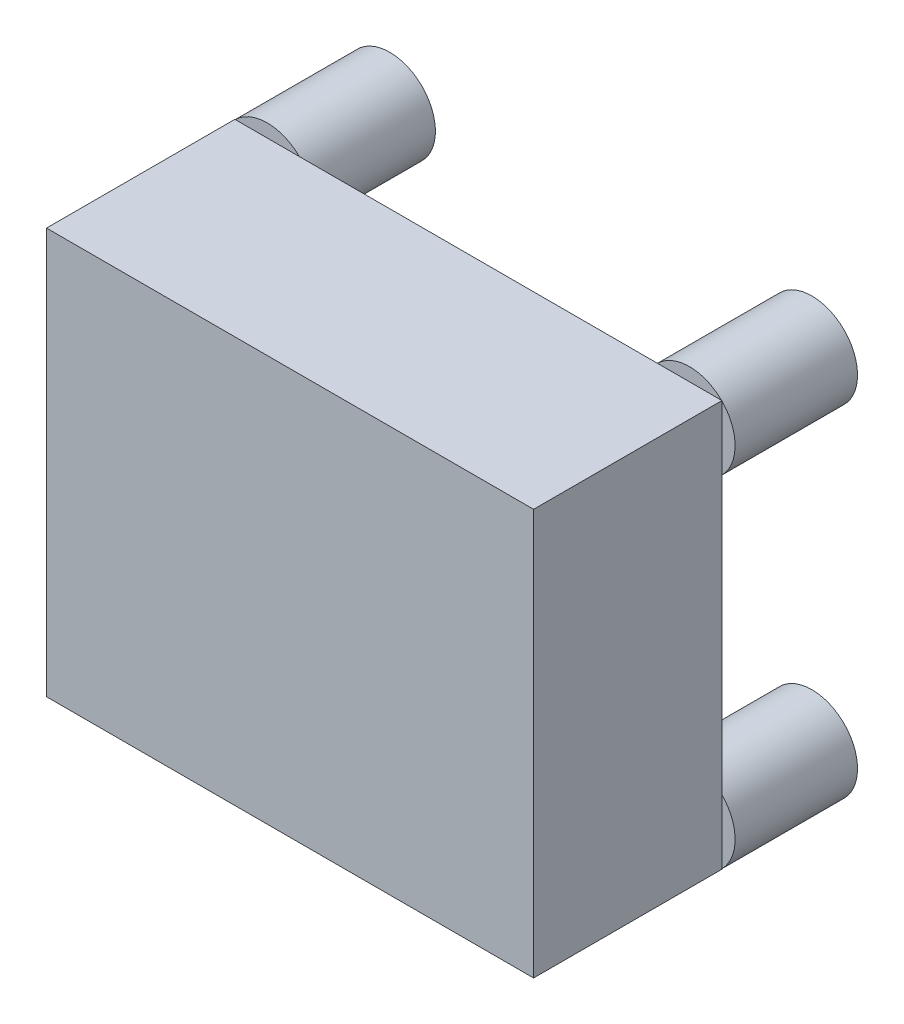
ISO-10303-21;
HEADER;
FILE_DESCRIPTION(('STEP AP214'),'2;1');
FILE_NAME('part.step','',(''),(''),'','','');
FILE_SCHEMA(('AUTOMOTIVE_DESIGN { 1 0 10303 214 1 1 1 1 }'));
ENDSEC;
DATA;
#1=APPLICATION_CONTEXT('core data for automotive mechanical design processes');
#2=APPLICATION_PROTOCOL_DEFINITION('international standard','automotive_design',2000,#1);
#3=PRODUCT_CONTEXT('',#1,'mechanical');
#4=PRODUCT('Part','Part','',(#3));
#5=PRODUCT_RELATED_PRODUCT_CATEGORY('part','',(#4));
#6=PRODUCT_DEFINITION_FORMATION('','',#4);
#7=PRODUCT_DEFINITION_CONTEXT('part definition',#1,'design');
#8=PRODUCT_DEFINITION('design','',#6,#7);
#9=PRODUCT_DEFINITION_SHAPE('','',#8);
#10=(LENGTH_UNIT() NAMED_UNIT(*) SI_UNIT(.MILLI.,.METRE.));
#11=(NAMED_UNIT(*) PLANE_ANGLE_UNIT() SI_UNIT($,.RADIAN.));
#12=(NAMED_UNIT(*) SI_UNIT($,.STERADIAN.) SOLID_ANGLE_UNIT());
#13=UNCERTAINTY_MEASURE_WITH_UNIT(LENGTH_MEASURE(1.E-05),#10,'distance_accuracy_value','');
#14=(GEOMETRIC_REPRESENTATION_CONTEXT(3) GLOBAL_UNCERTAINTY_ASSIGNED_CONTEXT((#13)) GLOBAL_UNIT_ASSIGNED_CONTEXT((#10,
#11,#12)) REPRESENTATION_CONTEXT('',''));
#15=CARTESIAN_POINT('',(0.,0.,0.));
#16=DIRECTION('',(0.,0.,1.));
#17=DIRECTION('',(1.,0.,0.));
#18=AXIS2_PLACEMENT_3D('',#15,#16,#17);
#19=CARTESIAN_POINT('',(0.,0.,0.));
#20=DIRECTION('',(0.,0.,-1.));
#21=DIRECTION('',(-1.,0.,0.));
#22=AXIS2_PLACEMENT_3D('',#19,#20,#21);
#23=PLANE('',#22);
#24=DIRECTION('',(0.,-1.,0.));
#25=VECTOR('',#24,1.);
#26=CARTESIAN_POINT('',(0.,0.,0.));
#27=LINE('',#26,#25);
#28=CARTESIAN_POINT('',(0.,26.7032052956016,0.));
#29=VERTEX_POINT('',#28);
#30=CARTESIAN_POINT('',(0.,5.04679470439843,0.));
#31=VERTEX_POINT('',#30);
#32=EDGE_CURVE('E151',#29,#31,#27,.T.);
#33=ORIENTED_EDGE('',*,*,#32,.F.);
#34=CARTESIAN_POINT('',(2.54,29.21,0.));
#35=DIRECTION('',(0.,0.,-1.));
#36=DIRECTION('',(-1.,0.,0.));
#37=AXIS2_PLACEMENT_3D('',#34,#35,#36);
#38=CIRCLE('',#37,3.5687);
#39=CARTESIAN_POINT('',(5.04679470439843,31.75,0.));
#40=VERTEX_POINT('',#39);
#41=EDGE_CURVE('E134',#40,#29,#38,.T.);
#42=ORIENTED_EDGE('',*,*,#41,.F.);
#43=DIRECTION('',(-1.,0.,0.));
#44=VECTOR('',#43,1.);
#45=CARTESIAN_POINT('',(0.,31.75,0.));
#46=LINE('',#45,#44);
#47=CARTESIAN_POINT('',(33.0532052956016,31.75,0.));
#48=VERTEX_POINT('',#47);
#49=EDGE_CURVE('E320',#48,#40,#46,.T.);
#50=ORIENTED_EDGE('',*,*,#49,.F.);
#51=CARTESIAN_POINT('',(35.56,29.21,0.));
#52=DIRECTION('',(0.,0.,-1.));
#53=DIRECTION('',(-1.,0.,0.));
#54=AXIS2_PLACEMENT_3D('',#51,#52,#53);
#55=CIRCLE('',#54,3.5687);
#56=CARTESIAN_POINT('',(38.1,26.7032052956016,0.));
#57=VERTEX_POINT('',#56);
#58=EDGE_CURVE('E129',#57,#48,#55,.T.);
#59=ORIENTED_EDGE('',*,*,#58,.F.);
#60=DIRECTION('',(0.,1.,0.));
#61=VECTOR('',#60,1.);
#62=CARTESIAN_POINT('',(38.1,0.,0.));
#63=LINE('',#62,#61);
#64=CARTESIAN_POINT('',(38.1,5.04679470439843,0.));
#65=VERTEX_POINT('',#64);
#66=EDGE_CURVE('E300',#65,#57,#63,.T.);
#67=ORIENTED_EDGE('',*,*,#66,.F.);
#68=CARTESIAN_POINT('',(35.56,2.54,0.));
#69=DIRECTION('',(0.,0.,-1.));
#70=DIRECTION('',(-1.,0.,0.));
#71=AXIS2_PLACEMENT_3D('',#68,#69,#70);
#72=CIRCLE('',#71,3.5687);
#73=CARTESIAN_POINT('',(33.0532052956016,0.,0.));
#74=VERTEX_POINT('',#73);
#75=EDGE_CURVE('E173',#74,#65,#72,.T.);
#76=ORIENTED_EDGE('',*,*,#75,.F.);
#77=DIRECTION('',(1.,0.,0.));
#78=VECTOR('',#77,1.);
#79=CARTESIAN_POINT('',(0.,0.,0.));
#80=LINE('',#79,#78);
#81=CARTESIAN_POINT('',(5.04679470439843,0.,0.));
#82=VERTEX_POINT('',#81);
#83=EDGE_CURVE('E299',#82,#74,#80,.T.);
#84=ORIENTED_EDGE('',*,*,#83,.F.);
#85=CARTESIAN_POINT('',(2.54,2.54,0.));
#86=DIRECTION('',(0.,0.,-1.));
#87=DIRECTION('',(-1.,0.,0.));
#88=AXIS2_PLACEMENT_3D('',#85,#86,#87);
#89=CIRCLE('',#88,3.5687);
#90=EDGE_CURVE('E175',#31,#82,#89,.T.);
#91=ORIENTED_EDGE('',*,*,#90,.F.);
#92=EDGE_LOOP('',(#33,#42,#50,#59,#67,#76,#84,#91));
#93=FACE_BOUND('',#92,.T.);
#94=ADVANCED_FACE('F33',(#93),#23,.T.);
#95=CARTESIAN_POINT('',(0.0332052956015729,31.75,0.));
#96=VERTEX_POINT('',#95);
#97=CARTESIAN_POINT('',(0.,31.75,0.));
#98=VERTEX_POINT('',#97);
#99=EDGE_CURVE('E143',#96,#98,#46,.T.);
#100=ORIENTED_EDGE('',*,*,#99,.F.);
#101=CARTESIAN_POINT('',(0.,31.7167947043984,0.));
#102=VERTEX_POINT('',#101);
#103=EDGE_CURVE('E48',#102,#96,#38,.T.);
#104=ORIENTED_EDGE('',*,*,#103,.F.);
#105=EDGE_CURVE('E142',#98,#102,#27,.T.);
#106=ORIENTED_EDGE('',*,*,#105,.F.);
#107=EDGE_LOOP('',(#100,#104,#106));
#108=FACE_BOUND('',#107,.T.);
#109=ADVANCED_FACE('F141',(#108),#23,.T.);
#110=CARTESIAN_POINT('',(38.1,31.7167947043984,0.));
#111=VERTEX_POINT('',#110);
#112=CARTESIAN_POINT('',(38.1,31.75,0.));
#113=VERTEX_POINT('',#112);
#114=EDGE_CURVE('E298',#111,#113,#63,.T.);
#115=ORIENTED_EDGE('',*,*,#114,.F.);
#116=CARTESIAN_POINT('',(38.0667947043984,31.75,0.));
#117=VERTEX_POINT('',#116);
#118=EDGE_CURVE('E220',#117,#111,#55,.T.);
#119=ORIENTED_EDGE('',*,*,#118,.F.);
#120=EDGE_CURVE('E182',#113,#117,#46,.T.);
#121=ORIENTED_EDGE('',*,*,#120,.F.);
#122=EDGE_LOOP('',(#115,#119,#121));
#123=FACE_BOUND('',#122,.T.);
#124=ADVANCED_FACE('F283',(#123),#23,.T.);
#125=CARTESIAN_POINT('',(0.,0.0332052956015729,0.));
#126=VERTEX_POINT('',#125);
#127=CARTESIAN_POINT('',(0.,0.,0.));
#128=VERTEX_POINT('',#127);
#129=EDGE_CURVE('E157',#126,#128,#27,.T.);
#130=ORIENTED_EDGE('',*,*,#129,.F.);
#131=CARTESIAN_POINT('',(2.54,2.54,0.));
#132=DIRECTION('',(0.,0.,-1.));
#133=DIRECTION('',(-1.,0.,0.));
#134=AXIS2_PLACEMENT_3D('',#131,#132,#133);
#135=CIRCLE('',#134,3.5687);
#136=CARTESIAN_POINT('',(0.0332052956015729,0.,0.));
#137=VERTEX_POINT('',#136);
#138=EDGE_CURVE('E11',#126,#137,#135,.F.);
#139=ORIENTED_EDGE('',*,*,#138,.T.);
#140=EDGE_CURVE('E296',#128,#137,#80,.T.);
#141=ORIENTED_EDGE('',*,*,#140,.F.);
#142=EDGE_LOOP('',(#130,#139,#141));
#143=FACE_BOUND('',#142,.T.);
#144=ADVANCED_FACE('F279',(#143),#23,.T.);
#145=CARTESIAN_POINT('',(38.1,0.0332052956015724,0.));
#146=VERTEX_POINT('',#145);
#147=CARTESIAN_POINT('',(38.0667947043984,0.,0.));
#148=VERTEX_POINT('',#147);
#149=EDGE_CURVE('E41',#146,#148,#72,.T.);
#150=ORIENTED_EDGE('',*,*,#149,.F.);
#151=CARTESIAN_POINT('',(38.1,0.,0.));
#152=VERTEX_POINT('',#151);
#153=EDGE_CURVE('E301',#152,#146,#63,.T.);
#154=ORIENTED_EDGE('',*,*,#153,.F.);
#155=EDGE_CURVE('E150',#148,#152,#80,.T.);
#156=ORIENTED_EDGE('',*,*,#155,.F.);
#157=EDGE_LOOP('',(#150,#154,#156));
#158=FACE_BOUND('',#157,.T.);
#159=ADVANCED_FACE('F287',(#158),#23,.T.);
#160=CARTESIAN_POINT('',(0.,0.,14.732));
#161=DIRECTION('',(1.,0.,0.));
#162=DIRECTION('',(0.,0.,-1.));
#163=AXIS2_PLACEMENT_3D('',#160,#161,#162);
#164=PLANE('',#163);
#165=ORIENTED_EDGE('',*,*,#105,.T.);
#166=DIRECTION('',(0.,1.,0.));
#167=VECTOR('',#166,1.);
#168=CARTESIAN_POINT('',(0.,0.,0.));
#169=LINE('',#168,#167);
#170=EDGE_CURVE('E123',#29,#102,#169,.T.);
#171=ORIENTED_EDGE('',*,*,#170,.F.);
#172=ORIENTED_EDGE('',*,*,#32,.T.);
#173=EDGE_CURVE('E153',#31,#126,#27,.T.);
#174=ORIENTED_EDGE('',*,*,#173,.T.);
#175=ORIENTED_EDGE('',*,*,#129,.T.);
#176=DIRECTION('',(0.,0.,-1.));
#177=VECTOR('',#176,1.);
#178=CARTESIAN_POINT('',(0.,0.,14.732));
#179=LINE('',#178,#177);
#180=CARTESIAN_POINT('',(0.,0.,14.732));
#181=VERTEX_POINT('',#180);
#182=EDGE_CURVE('E197',#181,#128,#179,.T.);
#183=ORIENTED_EDGE('',*,*,#182,.F.);
#184=DIRECTION('',(0.,-1.,0.));
#185=VECTOR('',#184,1.);
#186=CARTESIAN_POINT('',(0.,0.,14.732));
#187=LINE('',#186,#185);
#188=CARTESIAN_POINT('',(0.,31.75,14.732));
#189=VERTEX_POINT('',#188);
#190=EDGE_CURVE('E178',#189,#181,#187,.T.);
#191=ORIENTED_EDGE('',*,*,#190,.F.);
#192=DIRECTION('',(0.,0.,-1.));
#193=VECTOR('',#192,1.);
#194=CARTESIAN_POINT('',(0.,31.75,14.732));
#195=LINE('',#194,#193);
#196=EDGE_CURVE('E149',#189,#98,#195,.T.);
#197=ORIENTED_EDGE('',*,*,#196,.T.);
#198=EDGE_LOOP('',(#165,#171,#172,#174,#175,#183,#191,#197));
#199=FACE_BOUND('',#198,.T.);
#200=ADVANCED_FACE('F35',(#199),#164,.F.);
#201=CARTESIAN_POINT('',(0.,0.,14.732));
#202=DIRECTION('',(0.,1.,0.));
#203=DIRECTION('',(0.,0.,1.));
#204=AXIS2_PLACEMENT_3D('',#201,#202,#203);
#205=PLANE('',#204);
#206=ORIENTED_EDGE('',*,*,#140,.T.);
#207=EDGE_CURVE('E156',#137,#82,#80,.T.);
#208=ORIENTED_EDGE('',*,*,#207,.T.);
#209=ORIENTED_EDGE('',*,*,#83,.T.);
#210=EDGE_CURVE('E154',#74,#148,#80,.T.);
#211=ORIENTED_EDGE('',*,*,#210,.T.);
#212=ORIENTED_EDGE('',*,*,#155,.T.);
#213=DIRECTION('',(0.,0.,-1.));
#214=VECTOR('',#213,1.);
#215=CARTESIAN_POINT('',(38.1,0.,14.732));
#216=LINE('',#215,#214);
#217=CARTESIAN_POINT('',(38.1,0.,14.732));
#218=VERTEX_POINT('',#217);
#219=EDGE_CURVE('E191',#218,#152,#216,.T.);
#220=ORIENTED_EDGE('',*,*,#219,.F.);
#221=DIRECTION('',(1.,0.,0.));
#222=VECTOR('',#221,1.);
#223=CARTESIAN_POINT('',(0.,0.,14.732));
#224=LINE('',#223,#222);
#225=EDGE_CURVE('E181',#181,#218,#224,.T.);
#226=ORIENTED_EDGE('',*,*,#225,.F.);
#227=ORIENTED_EDGE('',*,*,#182,.T.);
#228=EDGE_LOOP('',(#206,#208,#209,#211,#212,#220,#226,#227));
#229=FACE_BOUND('',#228,.T.);
#230=ADVANCED_FACE('F304',(#229),#205,.F.);
#231=CARTESIAN_POINT('',(38.1,0.,14.732));
#232=DIRECTION('',(-1.,0.,0.));
#233=DIRECTION('',(0.,0.,1.));
#234=AXIS2_PLACEMENT_3D('',#231,#232,#233);
#235=PLANE('',#234);
#236=ORIENTED_EDGE('',*,*,#153,.T.);
#237=EDGE_CURVE('E314',#146,#65,#63,.T.);
#238=ORIENTED_EDGE('',*,*,#237,.T.);
#239=ORIENTED_EDGE('',*,*,#66,.T.);
#240=DIRECTION('',(0.,-1.,0.));
#241=VECTOR('',#240,1.);
#242=CARTESIAN_POINT('',(38.1,0.,0.));
#243=LINE('',#242,#241);
#244=EDGE_CURVE('E216',#111,#57,#243,.T.);
#245=ORIENTED_EDGE('',*,*,#244,.F.);
#246=ORIENTED_EDGE('',*,*,#114,.T.);
#247=DIRECTION('',(0.,0.,-1.));
#248=VECTOR('',#247,1.);
#249=CARTESIAN_POINT('',(38.1,31.75,14.732));
#250=LINE('',#249,#248);
#251=CARTESIAN_POINT('',(38.1,31.75,14.732));
#252=VERTEX_POINT('',#251);
#253=EDGE_CURVE('E188',#252,#113,#250,.T.);
#254=ORIENTED_EDGE('',*,*,#253,.F.);
#255=DIRECTION('',(0.,1.,0.));
#256=VECTOR('',#255,1.);
#257=CARTESIAN_POINT('',(38.1,0.,14.732));
#258=LINE('',#257,#256);
#259=EDGE_CURVE('E184',#218,#252,#258,.T.);
#260=ORIENTED_EDGE('',*,*,#259,.F.);
#261=ORIENTED_EDGE('',*,*,#219,.T.);
#262=EDGE_LOOP('',(#236,#238,#239,#245,#246,#254,#260,#261));
#263=FACE_BOUND('',#262,.T.);
#264=ADVANCED_FACE('F407',(#263),#235,.F.);
#265=CARTESIAN_POINT('',(0.,31.75,14.732));
#266=DIRECTION('',(0.,-1.,0.));
#267=DIRECTION('',(0.,0.,-1.));
#268=AXIS2_PLACEMENT_3D('',#265,#266,#267);
#269=PLANE('',#268);
#270=ORIENTED_EDGE('',*,*,#120,.T.);
#271=EDGE_CURVE('E322',#117,#48,#46,.T.);
#272=ORIENTED_EDGE('',*,*,#271,.T.);
#273=ORIENTED_EDGE('',*,*,#49,.T.);
#274=EDGE_CURVE('E318',#40,#96,#46,.T.);
#275=ORIENTED_EDGE('',*,*,#274,.T.);
#276=ORIENTED_EDGE('',*,*,#99,.T.);
#277=ORIENTED_EDGE('',*,*,#196,.F.);
#278=DIRECTION('',(-1.,0.,0.));
#279=VECTOR('',#278,1.);
#280=CARTESIAN_POINT('',(0.,31.75,14.732));
#281=LINE('',#280,#279);
#282=EDGE_CURVE('E185',#252,#189,#281,.T.);
#283=ORIENTED_EDGE('',*,*,#282,.F.);
#284=ORIENTED_EDGE('',*,*,#253,.T.);
#285=EDGE_LOOP('',(#270,#272,#273,#275,#276,#277,#283,#284));
#286=FACE_BOUND('',#285,.T.);
#287=ADVANCED_FACE('F326',(#286),#269,.F.);
#288=CARTESIAN_POINT('',(0.,0.,14.732));
#289=DIRECTION('',(0.,0.,-1.));
#290=DIRECTION('',(-1.,0.,0.));
#291=AXIS2_PLACEMENT_3D('',#288,#289,#290);
#292=PLANE('',#291);
#293=ORIENTED_EDGE('',*,*,#190,.T.);
#294=ORIENTED_EDGE('',*,*,#225,.T.);
#295=ORIENTED_EDGE('',*,*,#259,.T.);
#296=ORIENTED_EDGE('',*,*,#282,.T.);
#297=EDGE_LOOP('',(#293,#294,#295,#296));
#298=FACE_BOUND('',#297,.T.);
#299=ADVANCED_FACE('F395',(#298),#292,.F.);
#300=CARTESIAN_POINT('',(35.56,2.54,0.));
#301=DIRECTION('',(0.,0.,-1.));
#302=DIRECTION('',(-1.,0.,0.));
#303=AXIS2_PLACEMENT_3D('',#300,#301,#302);
#304=PLANE('',#303);
#305=ORIENTED_EDGE('',*,*,#237,.F.);
#306=EDGE_CURVE('E166',#65,#146,#72,.T.);
#307=ORIENTED_EDGE('',*,*,#306,.F.);
#308=EDGE_LOOP('',(#305,#307));
#309=FACE_BOUND('',#308,.T.);
#310=ADVANCED_FACE('F271',(#309),#304,.F.);
#311=CARTESIAN_POINT('',(35.56,2.54,-9.5758));
#312=DIRECTION('',(0.,0.,1.));
#313=DIRECTION('',(1.,0.,0.));
#314=AXIS2_PLACEMENT_3D('',#311,#312,#313);
#315=CYLINDRICAL_SURFACE('',#314,3.5687);
#316=CARTESIAN_POINT('',(35.56,2.54,-9.5758));
#317=DIRECTION('',(0.,0.,-1.));
#318=DIRECTION('',(-1.,0.,0.));
#319=AXIS2_PLACEMENT_3D('',#316,#317,#318);
#320=CIRCLE('',#319,3.5687);
#321=CARTESIAN_POINT('',(31.9913,2.54,-9.5758));
#322=VERTEX_POINT('',#321);
#323=EDGE_CURVE('E161',#322,#322,#320,.T.);
#324=ORIENTED_EDGE('',*,*,#323,.F.);
#325=EDGE_LOOP('',(#324));
#326=FACE_BOUND('',#325,.T.);
#327=ORIENTED_EDGE('',*,*,#306,.T.);
#328=ORIENTED_EDGE('',*,*,#149,.T.);
#329=EDGE_CURVE('E171',#148,#74,#72,.T.);
#330=ORIENTED_EDGE('',*,*,#329,.T.);
#331=ORIENTED_EDGE('',*,*,#75,.T.);
#332=EDGE_LOOP('',(#327,#328,#330,#331));
#333=FACE_BOUND('',#332,.T.);
#334=ADVANCED_FACE('F261',(#326,#333),#315,.T.);
#335=CARTESIAN_POINT('',(35.56,2.54,-9.5758));
#336=DIRECTION('',(0.,0.,-1.));
#337=DIRECTION('',(-1.,0.,0.));
#338=AXIS2_PLACEMENT_3D('',#335,#336,#337);
#339=PLANE('',#338);
#340=CARTESIAN_POINT('',(35.56,2.54,-9.5758));
#341=DIRECTION('',(0.,0.,-1.));
#342=DIRECTION('',(-1.,0.,0.));
#343=AXIS2_PLACEMENT_3D('',#340,#341,#342);
#344=CIRCLE('',#343,1.3462);
#345=CARTESIAN_POINT('',(34.2138,2.54,-9.5758));
#346=VERTEX_POINT('',#345);
#347=EDGE_CURVE('E243',#346,#346,#344,.T.);
#348=ORIENTED_EDGE('',*,*,#347,.F.);
#349=EDGE_LOOP('',(#348));
#350=FACE_BOUND('',#349,.T.);
#351=ORIENTED_EDGE('',*,*,#323,.T.);
#352=EDGE_LOOP('',(#351));
#353=FACE_BOUND('',#352,.T.);
#354=ADVANCED_FACE('F258',(#350,#353),#339,.T.);
#355=ORIENTED_EDGE('',*,*,#210,.F.);
#356=ORIENTED_EDGE('',*,*,#329,.F.);
#357=EDGE_LOOP('',(#355,#356));
#358=FACE_BOUND('',#357,.T.);
#359=ADVANCED_FACE('F260',(#358),#304,.F.);
#360=CARTESIAN_POINT('',(2.54,2.54,0.));
#361=DIRECTION('',(0.,0.,-1.));
#362=DIRECTION('',(-1.,0.,0.));
#363=AXIS2_PLACEMENT_3D('',#360,#361,#362);
#364=PLANE('',#363);
#365=EDGE_CURVE('E214',#126,#31,#89,.T.);
#366=ORIENTED_EDGE('',*,*,#365,.F.);
#367=ORIENTED_EDGE('',*,*,#173,.F.);
#368=EDGE_LOOP('',(#366,#367));
#369=FACE_BOUND('',#368,.T.);
#370=ADVANCED_FACE('F268',(#369),#364,.F.);
#371=EDGE_CURVE('E213',#82,#137,#89,.T.);
#372=ORIENTED_EDGE('',*,*,#371,.F.);
#373=ORIENTED_EDGE('',*,*,#207,.F.);
#374=EDGE_LOOP('',(#372,#373));
#375=FACE_BOUND('',#374,.T.);
#376=ADVANCED_FACE('F359',(#375),#364,.F.);
#377=CARTESIAN_POINT('',(2.54,2.54,-9.5758));
#378=DIRECTION('',(0.,0.,1.));
#379=DIRECTION('',(1.,0.,0.));
#380=AXIS2_PLACEMENT_3D('',#377,#378,#379);
#381=CYLINDRICAL_SURFACE('',#380,3.5687);
#382=CARTESIAN_POINT('',(2.54,2.54,-9.5758));
#383=DIRECTION('',(0.,0.,-1.));
#384=DIRECTION('',(-1.,0.,0.));
#385=AXIS2_PLACEMENT_3D('',#382,#383,#384);
#386=CIRCLE('',#385,3.5687);
#387=CARTESIAN_POINT('',(-1.0287,2.54,-9.5758));
#388=VERTEX_POINT('',#387);
#389=EDGE_CURVE('E207',#388,#388,#386,.T.);
#390=ORIENTED_EDGE('',*,*,#389,.F.);
#391=EDGE_LOOP('',(#390));
#392=FACE_BOUND('',#391,.T.);
#393=ORIENTED_EDGE('',*,*,#90,.T.);
#394=ORIENTED_EDGE('',*,*,#371,.T.);
#395=ORIENTED_EDGE('',*,*,#138,.F.);
#396=ORIENTED_EDGE('',*,*,#365,.T.);
#397=EDGE_LOOP('',(#393,#394,#395,#396));
#398=FACE_BOUND('',#397,.T.);
#399=ADVANCED_FACE('F356',(#392,#398),#381,.T.);
#400=CARTESIAN_POINT('',(2.54,2.54,-9.5758));
#401=DIRECTION('',(0.,0.,-1.));
#402=DIRECTION('',(-1.,0.,0.));
#403=AXIS2_PLACEMENT_3D('',#400,#401,#402);
#404=PLANE('',#403);
#405=CARTESIAN_POINT('',(2.54,2.54,-9.5758));
#406=DIRECTION('',(0.,0.,-1.));
#407=DIRECTION('',(-1.,0.,0.));
#408=AXIS2_PLACEMENT_3D('',#405,#406,#407);
#409=CIRCLE('',#408,1.3462);
#410=CARTESIAN_POINT('',(1.1938,2.54,-9.5758));
#411=VERTEX_POINT('',#410);
#412=EDGE_CURVE('E237',#411,#411,#409,.T.);
#413=ORIENTED_EDGE('',*,*,#412,.F.);
#414=EDGE_LOOP('',(#413));
#415=FACE_BOUND('',#414,.T.);
#416=ORIENTED_EDGE('',*,*,#389,.T.);
#417=EDGE_LOOP('',(#416));
#418=FACE_BOUND('',#417,.T.);
#419=ADVANCED_FACE('F350',(#415,#418),#404,.T.);
#420=CARTESIAN_POINT('',(35.56,29.21,0.));
#421=DIRECTION('',(0.,0.,-1.));
#422=DIRECTION('',(-1.,0.,0.));
#423=AXIS2_PLACEMENT_3D('',#420,#421,#422);
#424=PLANE('',#423);
#425=EDGE_CURVE('E472',#111,#57,#55,.T.);
#426=ORIENTED_EDGE('',*,*,#425,.F.);
#427=ORIENTED_EDGE('',*,*,#244,.T.);
#428=EDGE_LOOP('',(#426,#427));
#429=FACE_BOUND('',#428,.T.);
#430=ADVANCED_FACE('F346',(#429),#424,.F.);
#431=EDGE_CURVE('E55',#48,#117,#55,.T.);
#432=ORIENTED_EDGE('',*,*,#431,.F.);
#433=ORIENTED_EDGE('',*,*,#271,.F.);
#434=EDGE_LOOP('',(#432,#433));
#435=FACE_BOUND('',#434,.T.);
#436=ADVANCED_FACE('F349',(#435),#424,.F.);
#437=CARTESIAN_POINT('',(35.56,29.21,-9.5758));
#438=DIRECTION('',(0.,0.,1.));
#439=DIRECTION('',(1.,0.,0.));
#440=AXIS2_PLACEMENT_3D('',#437,#438,#439);
#441=CYLINDRICAL_SURFACE('',#440,3.5687);
#442=CARTESIAN_POINT('',(35.56,29.21,-9.5758));
#443=DIRECTION('',(0.,0.,-1.));
#444=DIRECTION('',(-1.,0.,0.));
#445=AXIS2_PLACEMENT_3D('',#442,#443,#444);
#446=CIRCLE('',#445,3.5687);
#447=CARTESIAN_POINT('',(31.9913,29.21,-9.5758));
#448=VERTEX_POINT('',#447);
#449=EDGE_CURVE('E218',#448,#448,#446,.T.);
#450=ORIENTED_EDGE('',*,*,#449,.F.);
#451=EDGE_LOOP('',(#450));
#452=FACE_BOUND('',#451,.T.);
#453=ORIENTED_EDGE('',*,*,#431,.T.);
#454=ORIENTED_EDGE('',*,*,#118,.T.);
#455=ORIENTED_EDGE('',*,*,#425,.T.);
#456=ORIENTED_EDGE('',*,*,#58,.T.);
#457=EDGE_LOOP('',(#453,#454,#455,#456));
#458=FACE_BOUND('',#457,.T.);
#459=ADVANCED_FACE('F344',(#452,#458),#441,.T.);
#460=CARTESIAN_POINT('',(35.56,29.21,-9.5758));
#461=DIRECTION('',(0.,0.,-1.));
#462=DIRECTION('',(-1.,0.,0.));
#463=AXIS2_PLACEMENT_3D('',#460,#461,#462);
#464=PLANE('',#463);
#465=CARTESIAN_POINT('',(35.56,29.21,-9.5758));
#466=DIRECTION('',(0.,0.,-1.));
#467=DIRECTION('',(-1.,0.,0.));
#468=AXIS2_PLACEMENT_3D('',#465,#466,#467);
#469=CIRCLE('',#468,1.3462);
#470=CARTESIAN_POINT('',(34.2138,29.21,-9.5758));
#471=VERTEX_POINT('',#470);
#472=EDGE_CURVE('E225',#471,#471,#469,.T.);
#473=ORIENTED_EDGE('',*,*,#472,.F.);
#474=EDGE_LOOP('',(#473));
#475=FACE_BOUND('',#474,.T.);
#476=ORIENTED_EDGE('',*,*,#449,.T.);
#477=EDGE_LOOP('',(#476));
#478=FACE_BOUND('',#477,.T.);
#479=ADVANCED_FACE('F338',(#475,#478),#464,.T.);
#480=CARTESIAN_POINT('',(2.54,29.21,0.));
#481=DIRECTION('',(0.,0.,-1.));
#482=DIRECTION('',(-1.,0.,0.));
#483=AXIS2_PLACEMENT_3D('',#480,#481,#482);
#484=PLANE('',#483);
#485=EDGE_CURVE('E125',#29,#102,#38,.T.);
#486=ORIENTED_EDGE('',*,*,#485,.F.);
#487=ORIENTED_EDGE('',*,*,#170,.T.);
#488=EDGE_LOOP('',(#486,#487));
#489=FACE_BOUND('',#488,.T.);
#490=ADVANCED_FACE('F124',(#489),#484,.F.);
#491=EDGE_CURVE('E145',#96,#40,#38,.T.);
#492=ORIENTED_EDGE('',*,*,#491,.F.);
#493=ORIENTED_EDGE('',*,*,#274,.F.);
#494=EDGE_LOOP('',(#492,#493));
#495=FACE_BOUND('',#494,.T.);
#496=ADVANCED_FACE('F328',(#495),#484,.F.);
#497=CARTESIAN_POINT('',(2.54,29.21,-9.5758));
#498=DIRECTION('',(0.,0.,1.));
#499=DIRECTION('',(1.,0.,0.));
#500=AXIS2_PLACEMENT_3D('',#497,#498,#499);
#501=CYLINDRICAL_SURFACE('',#500,3.5687);
#502=CARTESIAN_POINT('',(2.54,29.21,-9.5758));
#503=DIRECTION('',(0.,0.,-1.));
#504=DIRECTION('',(-1.,0.,0.));
#505=AXIS2_PLACEMENT_3D('',#502,#503,#504);
#506=CIRCLE('',#505,3.5687);
#507=CARTESIAN_POINT('',(-1.0287,29.21,-9.5758));
#508=VERTEX_POINT('',#507);
#509=EDGE_CURVE('E130',#508,#508,#506,.T.);
#510=ORIENTED_EDGE('',*,*,#509,.F.);
#511=EDGE_LOOP('',(#510));
#512=FACE_BOUND('',#511,.T.);
#513=ORIENTED_EDGE('',*,*,#103,.T.);
#514=ORIENTED_EDGE('',*,*,#491,.T.);
#515=ORIENTED_EDGE('',*,*,#41,.T.);
#516=ORIENTED_EDGE('',*,*,#485,.T.);
#517=EDGE_LOOP('',(#513,#514,#515,#516));
#518=FACE_BOUND('',#517,.T.);
#519=ADVANCED_FACE('F132',(#512,#518),#501,.T.);
#520=CARTESIAN_POINT('',(2.54,29.21,-9.5758));
#521=DIRECTION('',(0.,0.,-1.));
#522=DIRECTION('',(-1.,0.,0.));
#523=AXIS2_PLACEMENT_3D('',#520,#521,#522);
#524=PLANE('',#523);
#525=CARTESIAN_POINT('',(2.54,29.21,-9.5758));
#526=DIRECTION('',(0.,0.,-1.));
#527=DIRECTION('',(-1.,0.,0.));
#528=AXIS2_PLACEMENT_3D('',#525,#526,#527);
#529=CIRCLE('',#528,1.3462);
#530=CARTESIAN_POINT('',(1.1938,29.21,-9.5758));
#531=VERTEX_POINT('',#530);
#532=EDGE_CURVE('E231',#531,#531,#529,.T.);
#533=ORIENTED_EDGE('',*,*,#532,.F.);
#534=EDGE_LOOP('',(#533));
#535=FACE_BOUND('',#534,.T.);
#536=ORIENTED_EDGE('',*,*,#509,.T.);
#537=EDGE_LOOP('',(#536));
#538=FACE_BOUND('',#537,.T.);
#539=ADVANCED_FACE('F335',(#535,#538),#524,.T.);
#540=CARTESIAN_POINT('',(35.56,29.21,-0.685800000000002));
#541=DIRECTION('',(0.,0.,-1.));
#542=DIRECTION('',(-1.,0.,0.));
#543=AXIS2_PLACEMENT_3D('',#540,#541,#542);
#544=CYLINDRICAL_SURFACE('',#543,1.3462);
#545=CARTESIAN_POINT('',(35.56,29.21,-0.685800000000002));
#546=DIRECTION('',(0.,0.,-1.));
#547=DIRECTION('',(-1.,0.,0.));
#548=AXIS2_PLACEMENT_3D('',#545,#546,#547);
#549=CIRCLE('',#548,1.3462);
#550=CARTESIAN_POINT('',(34.2138,29.21,-0.685800000000002));
#551=VERTEX_POINT('',#550);
#552=EDGE_CURVE('E136',#551,#551,#549,.T.);
#553=ORIENTED_EDGE('',*,*,#552,.F.);
#554=EDGE_LOOP('',(#553));
#555=FACE_BOUND('',#554,.T.);
#556=ORIENTED_EDGE('',*,*,#472,.T.);
#557=EDGE_LOOP('',(#556));
#558=FACE_BOUND('',#557,.T.);
#559=ADVANCED_FACE('F527',(#555,#558),#544,.F.);
#560=CARTESIAN_POINT('',(35.56,29.21,-0.685800000000002));
#561=DIRECTION('',(0.,0.,-1.));
#562=DIRECTION('',(-1.,0.,0.));
#563=AXIS2_PLACEMENT_3D('',#560,#561,#562);
#564=PLANE('',#563);
#565=ORIENTED_EDGE('',*,*,#552,.T.);
#566=EDGE_LOOP('',(#565));
#567=FACE_BOUND('',#566,.T.);
#568=ADVANCED_FACE('F535',(#567),#564,.T.);
#569=CARTESIAN_POINT('',(2.54,29.21,-0.685800000000002));
#570=DIRECTION('',(0.,0.,-1.));
#571=DIRECTION('',(-1.,0.,0.));
#572=AXIS2_PLACEMENT_3D('',#569,#570,#571);
#573=CYLINDRICAL_SURFACE('',#572,1.3462);
#574=CARTESIAN_POINT('',(2.54,29.21,-0.685800000000002));
#575=DIRECTION('',(0.,0.,-1.));
#576=DIRECTION('',(-1.,0.,0.));
#577=AXIS2_PLACEMENT_3D('',#574,#575,#576);
#578=CIRCLE('',#577,1.3462);
#579=CARTESIAN_POINT('',(1.1938,29.21,-0.685800000000002));
#580=VERTEX_POINT('',#579);
#581=EDGE_CURVE('E228',#580,#580,#578,.T.);
#582=ORIENTED_EDGE('',*,*,#581,.F.);
#583=EDGE_LOOP('',(#582));
#584=FACE_BOUND('',#583,.T.);
#585=ORIENTED_EDGE('',*,*,#532,.T.);
#586=EDGE_LOOP('',(#585));
#587=FACE_BOUND('',#586,.T.);
#588=ADVANCED_FACE('F543',(#584,#587),#573,.F.);
#589=CARTESIAN_POINT('',(2.54,29.21,-0.685800000000002));
#590=DIRECTION('',(0.,0.,-1.));
#591=DIRECTION('',(-1.,0.,0.));
#592=AXIS2_PLACEMENT_3D('',#589,#590,#591);
#593=PLANE('',#592);
#594=ORIENTED_EDGE('',*,*,#581,.T.);
#595=EDGE_LOOP('',(#594));
#596=FACE_BOUND('',#595,.T.);
#597=ADVANCED_FACE('F552',(#596),#593,.T.);
#598=CARTESIAN_POINT('',(2.54,2.54,-0.685800000000002));
#599=DIRECTION('',(0.,0.,-1.));
#600=DIRECTION('',(-1.,0.,0.));
#601=AXIS2_PLACEMENT_3D('',#598,#599,#600);
#602=CYLINDRICAL_SURFACE('',#601,1.3462);
#603=CARTESIAN_POINT('',(2.54,2.54,-0.685800000000002));
#604=DIRECTION('',(0.,0.,-1.));
#605=DIRECTION('',(-1.,0.,0.));
#606=AXIS2_PLACEMENT_3D('',#603,#604,#605);
#607=CIRCLE('',#606,1.3462);
#608=CARTESIAN_POINT('',(1.1938,2.54,-0.685800000000002));
#609=VERTEX_POINT('',#608);
#610=EDGE_CURVE('E234',#609,#609,#607,.T.);
#611=ORIENTED_EDGE('',*,*,#610,.F.);
#612=EDGE_LOOP('',(#611));
#613=FACE_BOUND('',#612,.T.);
#614=ORIENTED_EDGE('',*,*,#412,.T.);
#615=EDGE_LOOP('',(#614));
#616=FACE_BOUND('',#615,.T.);
#617=ADVANCED_FACE('F561',(#613,#616),#602,.F.);
#618=CARTESIAN_POINT('',(2.54,2.54,-0.685800000000002));
#619=DIRECTION('',(0.,0.,-1.));
#620=DIRECTION('',(-1.,0.,0.));
#621=AXIS2_PLACEMENT_3D('',#618,#619,#620);
#622=PLANE('',#621);
#623=ORIENTED_EDGE('',*,*,#610,.T.);
#624=EDGE_LOOP('',(#623));
#625=FACE_BOUND('',#624,.T.);
#626=ADVANCED_FACE('F254',(#625),#622,.T.);
#627=CARTESIAN_POINT('',(35.56,2.54,-0.685800000000002));
#628=DIRECTION('',(0.,0.,-1.));
#629=DIRECTION('',(-1.,0.,0.));
#630=AXIS2_PLACEMENT_3D('',#627,#628,#629);
#631=CYLINDRICAL_SURFACE('',#630,1.3462);
#632=CARTESIAN_POINT('',(35.56,2.54,-0.685800000000002));
#633=DIRECTION('',(0.,0.,-1.));
#634=DIRECTION('',(-1.,0.,0.));
#635=AXIS2_PLACEMENT_3D('',#632,#633,#634);
#636=CIRCLE('',#635,1.3462);
#637=CARTESIAN_POINT('',(34.2138,2.54,-0.685800000000002));
#638=VERTEX_POINT('',#637);
#639=EDGE_CURVE('E240',#638,#638,#636,.T.);
#640=ORIENTED_EDGE('',*,*,#639,.F.);
#641=EDGE_LOOP('',(#640));
#642=FACE_BOUND('',#641,.T.);
#643=ORIENTED_EDGE('',*,*,#347,.T.);
#644=EDGE_LOOP('',(#643));
#645=FACE_BOUND('',#644,.T.);
#646=ADVANCED_FACE('F251',(#642,#645),#631,.F.);
#647=CARTESIAN_POINT('',(35.56,2.54,-0.685800000000002));
#648=DIRECTION('',(0.,0.,-1.));
#649=DIRECTION('',(-1.,0.,0.));
#650=AXIS2_PLACEMENT_3D('',#647,#648,#649);
#651=PLANE('',#650);
#652=ORIENTED_EDGE('',*,*,#639,.T.);
#653=EDGE_LOOP('',(#652));
#654=FACE_BOUND('',#653,.T.);
#655=ADVANCED_FACE('F249',(#654),#651,.T.);
#656=CLOSED_SHELL('',(#94,#109,#124,#144,#159,#200,#230,#264,#287,#299,#310,#334,#354,#359,#370,
#376,#399,#419,#430,#436,#459,#479,#490,#496,#519,#539,#559,#568,#588,#597,#617,#626,#646,#655));
#657=MANIFOLD_SOLID_BREP('B2',#656);
#658=ADVANCED_BREP_SHAPE_REPRESENTATION('',(#18,#657),#14);
#659=SHAPE_DEFINITION_REPRESENTATION(#9,#658);
ENDSEC;
END-ISO-10303-21;
